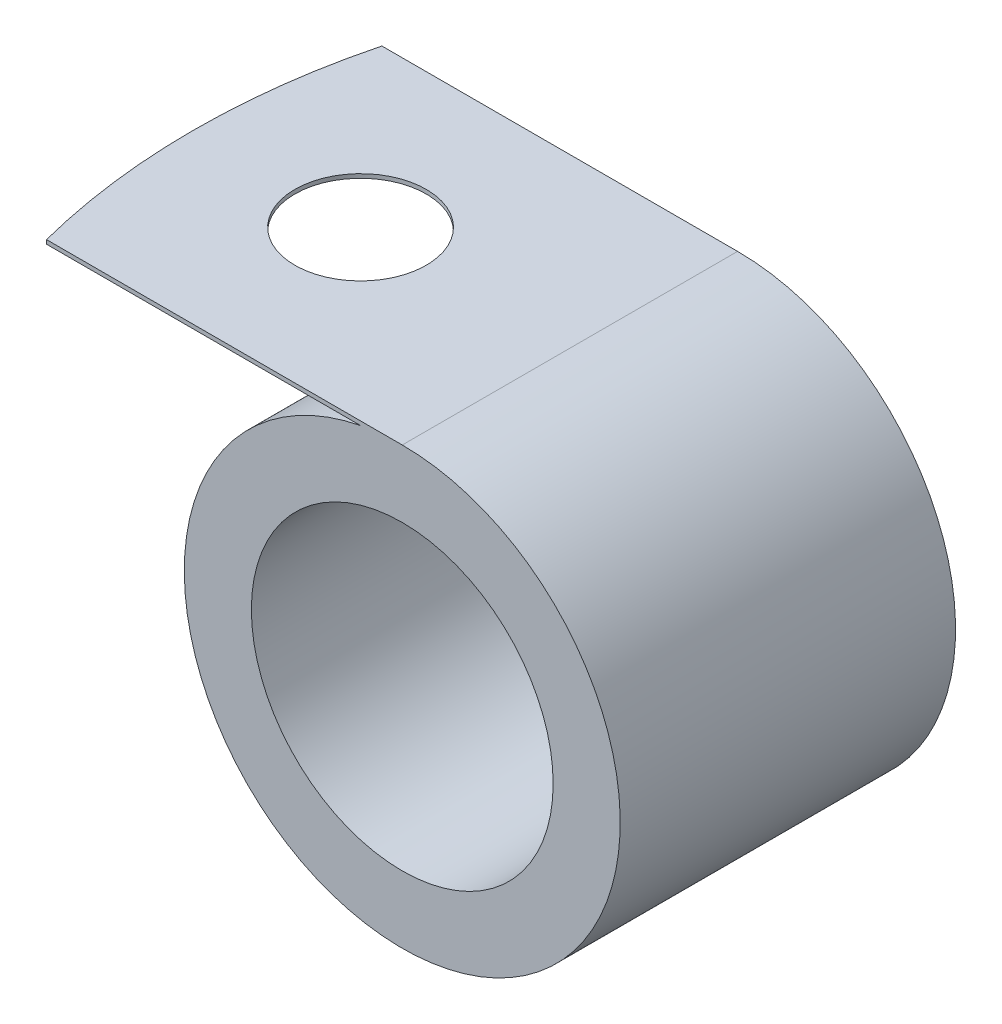
ISO-10303-21;
HEADER;
FILE_DESCRIPTION(('STEP AP214'),'2;1');
FILE_NAME('part.step','',(''),(''),'','','');
FILE_SCHEMA(('AUTOMOTIVE_DESIGN { 1 0 10303 214 1 1 1 1 }'));
ENDSEC;
DATA;
#1=APPLICATION_CONTEXT('core data for automotive mechanical design processes');
#2=APPLICATION_PROTOCOL_DEFINITION('international standard','automotive_design',2000,#1);
#3=PRODUCT_CONTEXT('',#1,'mechanical');
#4=PRODUCT('Part','Part','',(#3));
#5=PRODUCT_RELATED_PRODUCT_CATEGORY('part','',(#4));
#6=PRODUCT_DEFINITION_FORMATION('','',#4);
#7=PRODUCT_DEFINITION_CONTEXT('part definition',#1,'design');
#8=PRODUCT_DEFINITION('design','',#6,#7);
#9=PRODUCT_DEFINITION_SHAPE('','',#8);
#10=(LENGTH_UNIT() NAMED_UNIT(*) SI_UNIT(.MILLI.,.METRE.));
#11=(NAMED_UNIT(*) PLANE_ANGLE_UNIT() SI_UNIT($,.RADIAN.));
#12=(NAMED_UNIT(*) SI_UNIT($,.STERADIAN.) SOLID_ANGLE_UNIT());
#13=UNCERTAINTY_MEASURE_WITH_UNIT(LENGTH_MEASURE(1.E-05),#10,'distance_accuracy_value','');
#14=(GEOMETRIC_REPRESENTATION_CONTEXT(3) GLOBAL_UNCERTAINTY_ASSIGNED_CONTEXT((#13)) GLOBAL_UNIT_ASSIGNED_CONTEXT((#10,
#11,#12)) REPRESENTATION_CONTEXT('',''));
#15=CARTESIAN_POINT('',(0.,0.,0.));
#16=DIRECTION('',(0.,0.,1.));
#17=DIRECTION('',(1.,0.,0.));
#18=AXIS2_PLACEMENT_3D('',#15,#16,#17);
#19=CARTESIAN_POINT('',(0.,8.255,6.35));
#20=DIRECTION('',(0.,-1.,0.));
#21=DIRECTION('',(1.,0.,0.));
#22=AXIS2_PLACEMENT_3D('',#19,#20,#21);
#23=PLANE('',#22);
#24=CARTESIAN_POINT('',(-7.92889145922069,8.255,0.));
#25=DIRECTION('',(0.,1.,0.));
#26=DIRECTION('',(-1.,0.,0.));
#27=AXIS2_PLACEMENT_3D('',#24,#25,#26);
#28=CIRCLE('',#27,2.4892);
#29=CARTESIAN_POINT('',(-10.4180914592207,8.255,0.));
#30=VERTEX_POINT('',#29);
#31=EDGE_CURVE('E101',#30,#30,#28,.T.);
#32=ORIENTED_EDGE('',*,*,#31,.F.);
#33=EDGE_LOOP('',(#32));
#34=FACE_BOUND('',#33,.T.);
#35=CARTESIAN_POINT('',(11.1211085407793,8.255,0.));
#36=DIRECTION('',(0.,1.,0.));
#37=DIRECTION('',(-1.,0.,0.));
#38=AXIS2_PLACEMENT_3D('',#35,#36,#37);
#39=CIRCLE('',#38,25.4);
#40=CARTESIAN_POINT('',(-13.4723357076378,8.255,-6.35));
#41=VERTEX_POINT('',#40);
#42=CARTESIAN_POINT('',(-13.4723357076378,8.255,6.35));
#43=VERTEX_POINT('',#42);
#44=EDGE_CURVE('E107',#41,#43,#39,.T.);
#45=ORIENTED_EDGE('',*,*,#44,.T.);
#46=DIRECTION('',(-1.,0.,0.));
#47=VECTOR('',#46,1.);
#48=CARTESIAN_POINT('',(0.,8.255,6.35));
#49=LINE('',#48,#47);
#50=CARTESIAN_POINT('',(0.,8.255,6.35));
#51=VERTEX_POINT('',#50);
#52=EDGE_CURVE('E94',#51,#43,#49,.T.);
#53=ORIENTED_EDGE('',*,*,#52,.F.);
#54=DIRECTION('',(0.,0.,-1.));
#55=VECTOR('',#54,1.);
#56=CARTESIAN_POINT('',(0.,8.255,6.35));
#57=LINE('',#56,#55);
#58=CARTESIAN_POINT('',(0.,8.255,-6.35));
#59=VERTEX_POINT('',#58);
#60=EDGE_CURVE('E11',#51,#59,#57,.T.);
#61=ORIENTED_EDGE('',*,*,#60,.T.);
#62=DIRECTION('',(-1.,0.,0.));
#63=VECTOR('',#62,1.);
#64=CARTESIAN_POINT('',(0.,8.255,-6.35));
#65=LINE('',#64,#63);
#66=EDGE_CURVE('E78',#59,#41,#65,.T.);
#67=ORIENTED_EDGE('',*,*,#66,.T.);
#68=EDGE_LOOP('',(#45,#53,#61,#67));
#69=FACE_BOUND('',#68,.T.);
#70=ADVANCED_FACE('F33',(#34,#69),#23,.F.);
#71=CARTESIAN_POINT('',(-14.2788914592207,8.1026,6.35));
#72=DIRECTION('',(0.,1.,0.));
#73=DIRECTION('',(0.,0.,1.));
#74=AXIS2_PLACEMENT_3D('',#71,#72,#73);
#75=PLANE('',#74);
#76=CARTESIAN_POINT('',(-7.92889145922069,8.1026,0.));
#77=DIRECTION('',(0.,1.,0.));
#78=DIRECTION('',(0.,0.,1.));
#79=AXIS2_PLACEMENT_3D('',#76,#77,#78);
#80=CIRCLE('',#79,2.4892);
#81=CARTESIAN_POINT('',(-10.4180914592207,8.10259999999999,0.));
#82=VERTEX_POINT('',#81);
#83=EDGE_CURVE('E99',#82,#82,#80,.F.);
#84=ORIENTED_EDGE('',*,*,#83,.F.);
#85=EDGE_LOOP('',(#84));
#86=FACE_BOUND('',#85,.T.);
#87=DIRECTION('',(1.,0.,0.));
#88=VECTOR('',#87,1.);
#89=CARTESIAN_POINT('',(-14.2788914592207,8.1026,6.35));
#90=LINE('',#89,#88);
#91=CARTESIAN_POINT('',(-13.4723357076378,8.10259999999999,6.35));
#92=VERTEX_POINT('',#91);
#93=CARTESIAN_POINT('',(-1.57889145922069,8.1026,6.35));
#94=VERTEX_POINT('',#93);
#95=EDGE_CURVE('E57',#92,#94,#90,.T.);
#96=ORIENTED_EDGE('',*,*,#95,.F.);
#97=CARTESIAN_POINT('',(11.1211085407793,8.1026,0.));
#98=DIRECTION('',(0.,1.,0.));
#99=DIRECTION('',(0.,0.,1.));
#100=AXIS2_PLACEMENT_3D('',#97,#98,#99);
#101=CIRCLE('',#100,25.4);
#102=CARTESIAN_POINT('',(-13.4723357076378,8.1026,-6.35));
#103=VERTEX_POINT('',#102);
#104=EDGE_CURVE('E74',#92,#103,#101,.F.);
#105=ORIENTED_EDGE('',*,*,#104,.T.);
#106=DIRECTION('',(1.,0.,0.));
#107=VECTOR('',#106,1.);
#108=CARTESIAN_POINT('',(-14.2788914592207,8.1026,-6.35));
#109=LINE('',#108,#107);
#110=CARTESIAN_POINT('',(-1.57889145922069,8.1026,-6.35));
#111=VERTEX_POINT('',#110);
#112=EDGE_CURVE('E70',#103,#111,#109,.T.);
#113=ORIENTED_EDGE('',*,*,#112,.T.);
#114=DIRECTION('',(0.,0.,-1.));
#115=VECTOR('',#114,1.);
#116=CARTESIAN_POINT('',(-1.57889145922069,8.1026,6.35));
#117=LINE('',#116,#115);
#118=EDGE_CURVE('E41',#94,#111,#117,.T.);
#119=ORIENTED_EDGE('',*,*,#118,.F.);
#120=EDGE_LOOP('',(#96,#105,#113,#119));
#121=FACE_BOUND('',#120,.T.);
#122=ADVANCED_FACE('F72',(#86,#121),#75,.F.);
#123=CARTESIAN_POINT('',(0.,0.,6.35));
#124=DIRECTION('',(0.,0.,1.));
#125=DIRECTION('',(1.,0.,0.));
#126=AXIS2_PLACEMENT_3D('',#123,#124,#125);
#127=PLANE('',#126);
#128=CARTESIAN_POINT('',(0.,0.,6.35));
#129=DIRECTION('',(0.,0.,1.));
#130=DIRECTION('',(1.,0.,0.));
#131=AXIS2_PLACEMENT_3D('',#128,#129,#130);
#132=CIRCLE('',#131,5.715);
#133=CARTESIAN_POINT('',(5.715,0.,6.35));
#134=VERTEX_POINT('',#133);
#135=EDGE_CURVE('E86',#134,#134,#132,.T.);
#136=ORIENTED_EDGE('',*,*,#135,.F.);
#137=EDGE_LOOP('',(#136));
#138=FACE_BOUND('',#137,.T.);
#139=ORIENTED_EDGE('',*,*,#52,.T.);
#140=DIRECTION('',(0.,1.,0.));
#141=VECTOR('',#140,1.);
#142=CARTESIAN_POINT('',(-13.4723357076378,-8.256,6.35));
#143=LINE('',#142,#141);
#144=EDGE_CURVE('E111',#92,#43,#143,.T.);
#145=ORIENTED_EDGE('',*,*,#144,.F.);
#146=ORIENTED_EDGE('',*,*,#95,.T.);
#147=CARTESIAN_POINT('',(0.,0.,6.35));
#148=DIRECTION('',(0.,0.,1.));
#149=DIRECTION('',(1.,0.,0.));
#150=AXIS2_PLACEMENT_3D('',#147,#148,#149);
#151=CIRCLE('',#150,8.255);
#152=EDGE_CURVE('E77',#94,#51,#151,.T.);
#153=ORIENTED_EDGE('',*,*,#152,.T.);
#154=EDGE_LOOP('',(#139,#145,#146,#153));
#155=FACE_BOUND('',#154,.T.);
#156=ADVANCED_FACE('F117',(#138,#155),#127,.T.);
#157=CARTESIAN_POINT('',(0.,0.,-6.35));
#158=DIRECTION('',(0.,0.,1.));
#159=DIRECTION('',(1.,0.,0.));
#160=AXIS2_PLACEMENT_3D('',#157,#158,#159);
#161=PLANE('',#160);
#162=CARTESIAN_POINT('',(0.,0.,-6.35));
#163=DIRECTION('',(0.,0.,1.));
#164=DIRECTION('',(1.,0.,0.));
#165=AXIS2_PLACEMENT_3D('',#162,#163,#164);
#166=CIRCLE('',#165,5.715);
#167=CARTESIAN_POINT('',(5.715,0.,-6.35));
#168=VERTEX_POINT('',#167);
#169=EDGE_CURVE('E90',#168,#168,#166,.T.);
#170=ORIENTED_EDGE('',*,*,#169,.T.);
#171=EDGE_LOOP('',(#170));
#172=FACE_BOUND('',#171,.T.);
#173=DIRECTION('',(0.,1.,0.));
#174=VECTOR('',#173,1.);
#175=CARTESIAN_POINT('',(-13.4723357076378,-8.256,-6.35));
#176=LINE('',#175,#174);
#177=EDGE_CURVE('E48',#103,#41,#176,.T.);
#178=ORIENTED_EDGE('',*,*,#177,.T.);
#179=ORIENTED_EDGE('',*,*,#66,.F.);
#180=CARTESIAN_POINT('',(0.,0.,-6.35));
#181=DIRECTION('',(0.,0.,1.));
#182=DIRECTION('',(1.,0.,0.));
#183=AXIS2_PLACEMENT_3D('',#180,#181,#182);
#184=CIRCLE('',#183,8.255);
#185=EDGE_CURVE('E83',#111,#59,#184,.T.);
#186=ORIENTED_EDGE('',*,*,#185,.F.);
#187=ORIENTED_EDGE('',*,*,#112,.F.);
#188=EDGE_LOOP('',(#178,#179,#186,#187));
#189=FACE_BOUND('',#188,.T.);
#190=ADVANCED_FACE('F84',(#172,#189),#161,.F.);
#191=CARTESIAN_POINT('',(0.,0.,6.35));
#192=DIRECTION('',(0.,0.,-1.));
#193=DIRECTION('',(-1.,0.,0.));
#194=AXIS2_PLACEMENT_3D('',#191,#192,#193);
#195=CYLINDRICAL_SURFACE('',#194,8.255);
#196=ORIENTED_EDGE('',*,*,#185,.T.);
#197=ORIENTED_EDGE('',*,*,#60,.F.);
#198=ORIENTED_EDGE('',*,*,#152,.F.);
#199=ORIENTED_EDGE('',*,*,#118,.T.);
#200=EDGE_LOOP('',(#196,#197,#198,#199));
#201=FACE_BOUND('',#200,.T.);
#202=ADVANCED_FACE('F35',(#201),#195,.T.);
#203=CARTESIAN_POINT('',(0.,0.,6.35));
#204=DIRECTION('',(0.,0.,-1.));
#205=DIRECTION('',(-1.,0.,0.));
#206=AXIS2_PLACEMENT_3D('',#203,#204,#205);
#207=CYLINDRICAL_SURFACE('',#206,5.715);
#208=ORIENTED_EDGE('',*,*,#135,.T.);
#209=EDGE_LOOP('',(#208));
#210=FACE_BOUND('',#209,.T.);
#211=ORIENTED_EDGE('',*,*,#169,.F.);
#212=EDGE_LOOP('',(#211));
#213=FACE_BOUND('',#212,.T.);
#214=ADVANCED_FACE('F135',(#210,#213),#207,.F.);
#215=CARTESIAN_POINT('',(-7.92889145922069,-8.256,0.));
#216=DIRECTION('',(0.,1.,0.));
#217=DIRECTION('',(-1.,0.,0.));
#218=AXIS2_PLACEMENT_3D('',#215,#216,#217);
#219=CYLINDRICAL_SURFACE('',#218,2.4892);
#220=CARTESIAN_POINT('',(-10.4180914592207,8.255,0.));
#221=CARTESIAN_POINT('',(-10.4180914592207,8.2534125,0.));
#222=CARTESIAN_POINT('',(-10.4180914592207,8.25182499999999,0.));
#223=CARTESIAN_POINT('',(-10.4180914592207,8.24865,0.));
#224=CARTESIAN_POINT('',(-10.4180914592207,8.24706249999999,0.));
#225=CARTESIAN_POINT('',(-10.4180914592207,8.2438875,0.));
#226=CARTESIAN_POINT('',(-10.4180914592207,8.2423,0.));
#227=CARTESIAN_POINT('',(-10.4180914592207,8.239125,0.));
#228=CARTESIAN_POINT('',(-10.4180914592207,8.2375375,0.));
#229=CARTESIAN_POINT('',(-10.4180914592207,8.2343625,0.));
#230=CARTESIAN_POINT('',(-10.4180914592207,8.232775,0.));
#231=CARTESIAN_POINT('',(-10.4180914592207,8.2296,0.));
#232=CARTESIAN_POINT('',(-10.4180914592207,8.2280125,0.));
#233=CARTESIAN_POINT('',(-10.4180914592207,8.2248375,0.));
#234=CARTESIAN_POINT('',(-10.4180914592207,8.22325,0.));
#235=CARTESIAN_POINT('',(-10.4180914592207,8.220075,0.));
#236=CARTESIAN_POINT('',(-10.4180914592207,8.2184875,0.));
#237=CARTESIAN_POINT('',(-10.4180914592207,8.2153125,0.));
#238=CARTESIAN_POINT('',(-10.4180914592207,8.213725,0.));
#239=CARTESIAN_POINT('',(-10.4180914592207,8.21055,0.));
#240=CARTESIAN_POINT('',(-10.4180914592207,8.20896249999999,0.));
#241=CARTESIAN_POINT('',(-10.4180914592207,8.2057875,0.));
#242=CARTESIAN_POINT('',(-10.4180914592207,8.20419999999999,0.));
#243=CARTESIAN_POINT('',(-10.4180914592207,8.201025,0.));
#244=CARTESIAN_POINT('',(-10.4180914592207,8.19943749999999,0.));
#245=CARTESIAN_POINT('',(-10.4180914592207,8.1962625,0.));
#246=CARTESIAN_POINT('',(-10.4180914592207,8.19467499999999,0.));
#247=CARTESIAN_POINT('',(-10.4180914592207,8.1915,0.));
#248=CARTESIAN_POINT('',(-10.4180914592207,8.18991249999999,0.));
#249=CARTESIAN_POINT('',(-10.4180914592207,8.1867375,0.));
#250=CARTESIAN_POINT('',(-10.4180914592207,8.18514999999999,0.));
#251=CARTESIAN_POINT('',(-10.4180914592207,8.181975,0.));
#252=CARTESIAN_POINT('',(-10.4180914592207,8.18038749999999,0.));
#253=CARTESIAN_POINT('',(-10.4180914592207,8.17721249999999,0.));
#254=CARTESIAN_POINT('',(-10.4180914592207,8.17562499999999,0.));
#255=CARTESIAN_POINT('',(-10.4180914592207,8.17244999999999,0.));
#256=CARTESIAN_POINT('',(-10.4180914592207,8.17086249999999,0.));
#257=CARTESIAN_POINT('',(-10.4180914592207,8.16768749999999,0.));
#258=CARTESIAN_POINT('',(-10.4180914592207,8.16609999999999,0.));
#259=CARTESIAN_POINT('',(-10.4180914592207,8.16292499999999,0.));
#260=CARTESIAN_POINT('',(-10.4180914592207,8.16133749999999,0.));
#261=CARTESIAN_POINT('',(-10.4180914592207,8.15816249999999,0.));
#262=CARTESIAN_POINT('',(-10.4180914592207,8.15657499999999,0.));
#263=CARTESIAN_POINT('',(-10.4180914592207,8.15339999999999,0.));
#264=CARTESIAN_POINT('',(-10.4180914592207,8.15181249999999,0.));
#265=CARTESIAN_POINT('',(-10.4180914592207,8.14863749999999,0.));
#266=CARTESIAN_POINT('',(-10.4180914592207,8.14704999999999,0.));
#267=CARTESIAN_POINT('',(-10.4180914592207,8.14387499999999,0.));
#268=CARTESIAN_POINT('',(-10.4180914592207,8.14228749999999,0.));
#269=CARTESIAN_POINT('',(-10.4180914592207,8.13911249999999,0.));
#270=CARTESIAN_POINT('',(-10.4180914592207,8.13752499999999,0.));
#271=CARTESIAN_POINT('',(-10.4180914592207,8.13434999999999,0.));
#272=CARTESIAN_POINT('',(-10.4180914592207,8.13276249999999,0.));
#273=CARTESIAN_POINT('',(-10.4180914592207,8.12958749999999,0.));
#274=CARTESIAN_POINT('',(-10.4180914592207,8.12799999999999,0.));
#275=CARTESIAN_POINT('',(-10.4180914592207,8.12482499999999,0.));
#276=CARTESIAN_POINT('',(-10.4180914592207,8.12323749999999,0.));
#277=CARTESIAN_POINT('',(-10.4180914592207,8.12006249999999,0.));
#278=CARTESIAN_POINT('',(-10.4180914592207,8.11847499999999,0.));
#279=CARTESIAN_POINT('',(-10.4180914592207,8.11529999999999,0.));
#280=CARTESIAN_POINT('',(-10.4180914592207,8.11371249999999,0.));
#281=CARTESIAN_POINT('',(-10.4180914592207,8.11053749999999,0.));
#282=CARTESIAN_POINT('',(-10.4180914592207,8.10894999999999,0.));
#283=CARTESIAN_POINT('',(-10.4180914592207,8.10577499999999,0.));
#284=CARTESIAN_POINT('',(-10.4180914592207,8.10418749999999,0.));
#285=CARTESIAN_POINT('',(-10.4180914592207,8.10259999999999,0.));
#286=B_SPLINE_CURVE_WITH_KNOTS('',3,(#220,#221,#222,#223,#224,#225,#226,#227,#228,#229,#230,
#231,#232,#233,#234,#235,#236,#237,#238,#239,#240,#241,#242,#243,#244,#245,#246,#247,#248,#249,
#250,#251,#252,#253,#254,#255,#256,#257,#258,#259,#260,#261,#262,#263,#264,#265,#266,#267,#268,
#269,#270,#271,#272,#273,#274,#275,#276,#277,#278,#279,#280,#281,#282,#283,#284,#285),
.UNSPECIFIED.,.F.,.F.,(4,2,2,2,2,2,2,2,2,2,2,2,2,2,2,2,2,2,2,2,2,2,2,2,2,2,2,2,2,2,2,2,4),(0.,
0.00476250000000164,0.00952499999999981,0.0142875000000015,0.0190499999999996,
0.0238125000000013,0.0285749999999994,0.0333375000000011,0.0380999999999992,0.0428625000000009,
0.0476250000000025,0.0523875000000007,0.0571500000000023,0.0619125000000005,0.0666750000000021,
0.0714375000000003,0.076200000000002,0.0809625000000036,0.0857250000000018,0.0904875000000034,
0.0952500000000016,0.100012500000003,0.104775000000001,0.109537500000003,0.114300000000005,
0.119062500000003,0.123825000000004,0.128587500000003,0.133350000000004,0.138112500000002,
0.142875000000004,0.147637500000002,0.152400000000004),.UNSPECIFIED.);
#287=EDGE_CURVE('BSEAM138',#30,#82,#286,.T.);
#288=ORIENTED_EDGE('',*,*,#31,.T.);
#289=ORIENTED_EDGE('',*,*,#83,.T.);
#290=ORIENTED_EDGE('',*,*,#287,.T.);
#291=ORIENTED_EDGE('',*,*,#287,.F.);
#292=EDGE_LOOP('',(#288,#290,#289,#291));
#293=FACE_BOUND('',#292,.T.);
#294=ADVANCED_FACE('F138',(#293),#219,.F.);
#295=CARTESIAN_POINT('',(11.1211085407793,-8.256,0.));
#296=DIRECTION('',(0.,1.,0.));
#297=DIRECTION('',(-1.,0.,0.));
#298=AXIS2_PLACEMENT_3D('',#295,#296,#297);
#299=CYLINDRICAL_SURFACE('',#298,25.4);
#300=ORIENTED_EDGE('',*,*,#104,.F.);
#301=ORIENTED_EDGE('',*,*,#144,.T.);
#302=ORIENTED_EDGE('',*,*,#44,.F.);
#303=ORIENTED_EDGE('',*,*,#177,.F.);
#304=EDGE_LOOP('',(#300,#301,#302,#303));
#305=FACE_BOUND('',#304,.T.);
#306=ADVANCED_FACE('F114',(#305),#299,.T.);
#307=CLOSED_SHELL('',(#70,#122,#156,#190,#202,#214,#294,#306));
#308=MANIFOLD_SOLID_BREP('B2',#307);
#309=ADVANCED_BREP_SHAPE_REPRESENTATION('',(#18,#308),#14);
#310=SHAPE_DEFINITION_REPRESENTATION(#9,#309);
ENDSEC;
END-ISO-10303-21;
